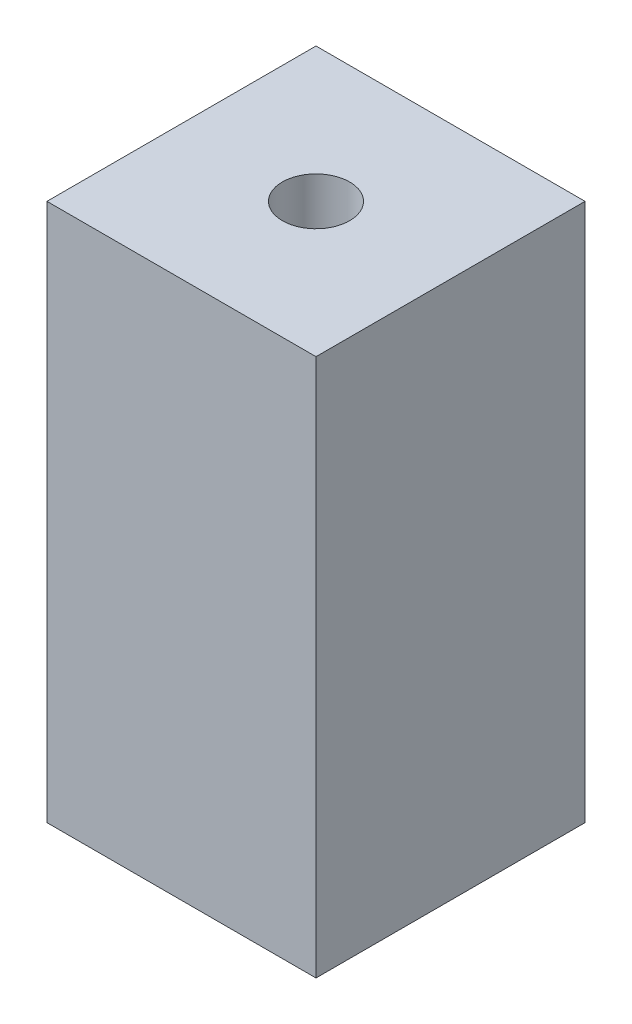
ISO-10303-21;
HEADER;
FILE_DESCRIPTION(('STEP AP214'),'2;1');
FILE_NAME('part.step','',(''),(''),'','','');
FILE_SCHEMA(('AUTOMOTIVE_DESIGN { 1 0 10303 214 1 1 1 1 }'));
ENDSEC;
DATA;
#1=APPLICATION_CONTEXT('core data for automotive mechanical design processes');
#2=APPLICATION_PROTOCOL_DEFINITION('international standard','automotive_design',2000,#1);
#3=PRODUCT_CONTEXT('',#1,'mechanical');
#4=PRODUCT('Part','Part','',(#3));
#5=PRODUCT_RELATED_PRODUCT_CATEGORY('part','',(#4));
#6=PRODUCT_DEFINITION_FORMATION('','',#4);
#7=PRODUCT_DEFINITION_CONTEXT('part definition',#1,'design');
#8=PRODUCT_DEFINITION('design','',#6,#7);
#9=PRODUCT_DEFINITION_SHAPE('','',#8);
#10=(LENGTH_UNIT() NAMED_UNIT(*) SI_UNIT(.MILLI.,.METRE.));
#11=(NAMED_UNIT(*) PLANE_ANGLE_UNIT() SI_UNIT($,.RADIAN.));
#12=(NAMED_UNIT(*) SI_UNIT($,.STERADIAN.) SOLID_ANGLE_UNIT());
#13=UNCERTAINTY_MEASURE_WITH_UNIT(LENGTH_MEASURE(1.E-05),#10,'distance_accuracy_value','');
#14=(GEOMETRIC_REPRESENTATION_CONTEXT(3) GLOBAL_UNCERTAINTY_ASSIGNED_CONTEXT((#13)) GLOBAL_UNIT_ASSIGNED_CONTEXT((#10,
#11,#12)) REPRESENTATION_CONTEXT('',''));
#15=CARTESIAN_POINT('',(0.,0.,0.));
#16=DIRECTION('',(0.,0.,1.));
#17=DIRECTION('',(1.,0.,0.));
#18=AXIS2_PLACEMENT_3D('',#15,#16,#17);
#19=CARTESIAN_POINT('',(25.4,101.6,25.4));
#20=DIRECTION('',(-1.,0.,0.));
#21=DIRECTION('',(0.,0.,1.));
#22=AXIS2_PLACEMENT_3D('',#19,#20,#21);
#23=PLANE('',#22);
#24=DIRECTION('',(0.,0.,-1.));
#25=VECTOR('',#24,1.);
#26=CARTESIAN_POINT('',(25.4,0.,25.4));
#27=LINE('',#26,#25);
#28=CARTESIAN_POINT('',(25.4,0.,25.4));
#29=VERTEX_POINT('',#28);
#30=CARTESIAN_POINT('',(25.4,0.,-25.4));
#31=VERTEX_POINT('',#30);
#32=EDGE_CURVE('E98',#29,#31,#27,.T.);
#33=ORIENTED_EDGE('',*,*,#32,.T.);
#34=DIRECTION('',(0.,-1.,0.));
#35=VECTOR('',#34,1.);
#36=CARTESIAN_POINT('',(25.4,101.6,-25.4));
#37=LINE('',#36,#35);
#38=CARTESIAN_POINT('',(25.4,101.6,-25.4));
#39=VERTEX_POINT('',#38);
#40=EDGE_CURVE('E11',#39,#31,#37,.T.);
#41=ORIENTED_EDGE('',*,*,#40,.F.);
#42=DIRECTION('',(0.,0.,-1.));
#43=VECTOR('',#42,1.);
#44=CARTESIAN_POINT('',(25.4,101.6,25.4));
#45=LINE('',#44,#43);
#46=CARTESIAN_POINT('',(25.4,101.6,25.4));
#47=VERTEX_POINT('',#46);
#48=EDGE_CURVE('E86',#47,#39,#45,.T.);
#49=ORIENTED_EDGE('',*,*,#48,.F.);
#50=DIRECTION('',(0.,-1.,0.));
#51=VECTOR('',#50,1.);
#52=CARTESIAN_POINT('',(25.4,101.6,25.4));
#53=LINE('',#52,#51);
#54=EDGE_CURVE('E94',#47,#29,#53,.T.);
#55=ORIENTED_EDGE('',*,*,#54,.T.);
#56=EDGE_LOOP('',(#33,#41,#49,#55));
#57=FACE_BOUND('',#56,.T.);
#58=ADVANCED_FACE('F35',(#57),#23,.F.);
#59=CARTESIAN_POINT('',(-25.4,101.6,-25.4));
#60=DIRECTION('',(0.,0.,1.));
#61=DIRECTION('',(1.,0.,0.));
#62=AXIS2_PLACEMENT_3D('',#59,#60,#61);
#63=PLANE('',#62);
#64=DIRECTION('',(-1.,0.,0.));
#65=VECTOR('',#64,1.);
#66=CARTESIAN_POINT('',(-25.4,0.,-25.4));
#67=LINE('',#66,#65);
#68=CARTESIAN_POINT('',(-25.4,0.,-25.4));
#69=VERTEX_POINT('',#68);
#70=EDGE_CURVE('E90',#31,#69,#67,.T.);
#71=ORIENTED_EDGE('',*,*,#70,.T.);
#72=DIRECTION('',(0.,-1.,0.));
#73=VECTOR('',#72,1.);
#74=CARTESIAN_POINT('',(-25.4,101.6,-25.4));
#75=LINE('',#74,#73);
#76=CARTESIAN_POINT('',(-25.4,101.6,-25.4));
#77=VERTEX_POINT('',#76);
#78=EDGE_CURVE('E43',#77,#69,#75,.T.);
#79=ORIENTED_EDGE('',*,*,#78,.F.);
#80=DIRECTION('',(-1.,0.,0.));
#81=VECTOR('',#80,1.);
#82=CARTESIAN_POINT('',(-25.4,101.6,-25.4));
#83=LINE('',#82,#81);
#84=EDGE_CURVE('E81',#39,#77,#83,.T.);
#85=ORIENTED_EDGE('',*,*,#84,.F.);
#86=ORIENTED_EDGE('',*,*,#40,.T.);
#87=EDGE_LOOP('',(#71,#79,#85,#86));
#88=FACE_BOUND('',#87,.T.);
#89=ADVANCED_FACE('F89',(#88),#63,.F.);
#90=CARTESIAN_POINT('',(-25.4,101.6,25.4));
#91=DIRECTION('',(1.,0.,0.));
#92=DIRECTION('',(0.,0.,-1.));
#93=AXIS2_PLACEMENT_3D('',#90,#91,#92);
#94=PLANE('',#93);
#95=DIRECTION('',(0.,0.,1.));
#96=VECTOR('',#95,1.);
#97=CARTESIAN_POINT('',(-25.4,0.,25.4));
#98=LINE('',#97,#96);
#99=CARTESIAN_POINT('',(-25.4,0.,25.4));
#100=VERTEX_POINT('',#99);
#101=EDGE_CURVE('E68',#69,#100,#98,.T.);
#102=ORIENTED_EDGE('',*,*,#101,.T.);
#103=DIRECTION('',(0.,-1.,0.));
#104=VECTOR('',#103,1.);
#105=CARTESIAN_POINT('',(-25.4,101.6,25.4));
#106=LINE('',#105,#104);
#107=CARTESIAN_POINT('',(-25.4,101.6,25.4));
#108=VERTEX_POINT('',#107);
#109=EDGE_CURVE('E91',#108,#100,#106,.T.);
#110=ORIENTED_EDGE('',*,*,#109,.F.);
#111=DIRECTION('',(0.,0.,1.));
#112=VECTOR('',#111,1.);
#113=CARTESIAN_POINT('',(-25.4,101.6,25.4));
#114=LINE('',#113,#112);
#115=EDGE_CURVE('E84',#77,#108,#114,.T.);
#116=ORIENTED_EDGE('',*,*,#115,.F.);
#117=ORIENTED_EDGE('',*,*,#78,.T.);
#118=EDGE_LOOP('',(#102,#110,#116,#117));
#119=FACE_BOUND('',#118,.T.);
#120=ADVANCED_FACE('F92',(#119),#94,.F.);
#121=CARTESIAN_POINT('',(-25.4,101.6,25.4));
#122=DIRECTION('',(0.,0.,-1.));
#123=DIRECTION('',(-1.,0.,0.));
#124=AXIS2_PLACEMENT_3D('',#121,#122,#123);
#125=PLANE('',#124);
#126=DIRECTION('',(1.,0.,0.));
#127=VECTOR('',#126,1.);
#128=CARTESIAN_POINT('',(-25.4,0.,25.4));
#129=LINE('',#128,#127);
#130=EDGE_CURVE('E74',#100,#29,#129,.T.);
#131=ORIENTED_EDGE('',*,*,#130,.T.);
#132=ORIENTED_EDGE('',*,*,#54,.F.);
#133=DIRECTION('',(1.,0.,0.));
#134=VECTOR('',#133,1.);
#135=CARTESIAN_POINT('',(-25.4,101.6,25.4));
#136=LINE('',#135,#134);
#137=EDGE_CURVE('E51',#108,#47,#136,.T.);
#138=ORIENTED_EDGE('',*,*,#137,.F.);
#139=ORIENTED_EDGE('',*,*,#109,.T.);
#140=EDGE_LOOP('',(#131,#132,#138,#139));
#141=FACE_BOUND('',#140,.T.);
#142=ADVANCED_FACE('F106',(#141),#125,.F.);
#143=CARTESIAN_POINT('',(0.,101.6,0.));
#144=DIRECTION('',(0.,-1.,0.));
#145=DIRECTION('',(0.,0.,-1.));
#146=AXIS2_PLACEMENT_3D('',#143,#144,#145);
#147=PLANE('',#146);
#148=CARTESIAN_POINT('',(0.,101.6,0.));
#149=DIRECTION('',(0.,1.,0.));
#150=DIRECTION('',(0.,0.,1.));
#151=AXIS2_PLACEMENT_3D('',#148,#149,#150);
#152=CIRCLE('',#151,6.35);
#153=CARTESIAN_POINT('',(0.,101.6,6.35));
#154=VERTEX_POINT('',#153);
#155=EDGE_CURVE('E112',#154,#154,#152,.T.);
#156=ORIENTED_EDGE('',*,*,#155,.F.);
#157=EDGE_LOOP('',(#156));
#158=FACE_BOUND('',#157,.T.);
#159=ORIENTED_EDGE('',*,*,#48,.T.);
#160=ORIENTED_EDGE('',*,*,#84,.T.);
#161=ORIENTED_EDGE('',*,*,#115,.T.);
#162=ORIENTED_EDGE('',*,*,#137,.T.);
#163=EDGE_LOOP('',(#159,#160,#161,#162));
#164=FACE_BOUND('',#163,.T.);
#165=ADVANCED_FACE('F82',(#158,#164),#147,.F.);
#166=CARTESIAN_POINT('',(0.,0.,0.));
#167=DIRECTION('',(0.,-1.,0.));
#168=DIRECTION('',(0.,0.,-1.));
#169=AXIS2_PLACEMENT_3D('',#166,#167,#168);
#170=PLANE('',#169);
#171=ORIENTED_EDGE('',*,*,#32,.F.);
#172=ORIENTED_EDGE('',*,*,#130,.F.);
#173=ORIENTED_EDGE('',*,*,#101,.F.);
#174=ORIENTED_EDGE('',*,*,#70,.F.);
#175=EDGE_LOOP('',(#171,#172,#173,#174));
#176=FACE_BOUND('',#175,.T.);
#177=ADVANCED_FACE('F109',(#176),#170,.T.);
#178=CARTESIAN_POINT('',(0.,91.6,0.));
#179=DIRECTION('',(0.,1.,0.));
#180=DIRECTION('',(0.,0.,1.));
#181=AXIS2_PLACEMENT_3D('',#178,#179,#180);
#182=CYLINDRICAL_SURFACE('',#181,6.35);
#183=CARTESIAN_POINT('',(0.,91.6,0.));
#184=DIRECTION('',(0.,1.,0.));
#185=DIRECTION('',(0.,0.,1.));
#186=AXIS2_PLACEMENT_3D('',#183,#184,#185);
#187=CIRCLE('',#186,6.35);
#188=CARTESIAN_POINT('',(0.,91.6,6.35));
#189=VERTEX_POINT('',#188);
#190=EDGE_CURVE('E101',#189,#189,#187,.T.);
#191=ORIENTED_EDGE('',*,*,#190,.F.);
#192=EDGE_LOOP('',(#191));
#193=FACE_BOUND('',#192,.T.);
#194=ORIENTED_EDGE('',*,*,#155,.T.);
#195=EDGE_LOOP('',(#194));
#196=FACE_BOUND('',#195,.T.);
#197=ADVANCED_FACE('F120',(#193,#196),#182,.F.);
#198=CARTESIAN_POINT('',(0.,91.6,0.));
#199=DIRECTION('',(0.,1.,0.));
#200=DIRECTION('',(0.,0.,1.));
#201=AXIS2_PLACEMENT_3D('',#198,#199,#200);
#202=PLANE('',#201);
#203=ORIENTED_EDGE('',*,*,#190,.T.);
#204=EDGE_LOOP('',(#203));
#205=FACE_BOUND('',#204,.T.);
#206=ADVANCED_FACE('F118',(#205),#202,.T.);
#207=CLOSED_SHELL('',(#58,#89,#120,#142,#165,#177,#197,#206));
#208=MANIFOLD_SOLID_BREP('B2',#207);
#209=ADVANCED_BREP_SHAPE_REPRESENTATION('',(#18,#208),#14);
#210=SHAPE_DEFINITION_REPRESENTATION(#9,#209);
ENDSEC;
END-ISO-10303-21;
